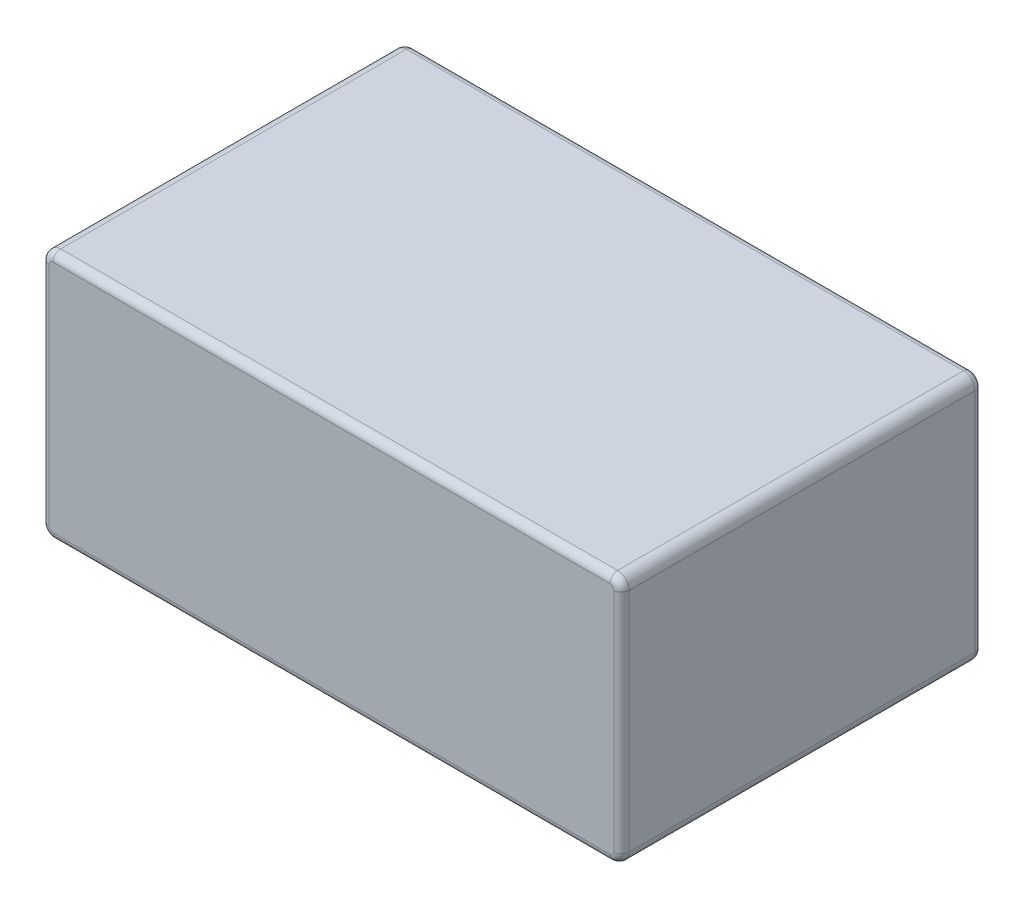
ISO-10303-21;
HEADER;
FILE_DESCRIPTION(('STEP AP214'),'2;1');
FILE_NAME('part.step','',(''),(''),'','','');
FILE_SCHEMA(('AUTOMOTIVE_DESIGN { 1 0 10303 214 1 1 1 1 }'));
ENDSEC;
DATA;
#1=APPLICATION_CONTEXT('core data for automotive mechanical design processes');
#2=APPLICATION_PROTOCOL_DEFINITION('international standard','automotive_design',2000,#1);
#3=PRODUCT_CONTEXT('',#1,'mechanical');
#4=PRODUCT('Part','Part','',(#3));
#5=PRODUCT_RELATED_PRODUCT_CATEGORY('part','',(#4));
#6=PRODUCT_DEFINITION_FORMATION('','',#4);
#7=PRODUCT_DEFINITION_CONTEXT('part definition',#1,'design');
#8=PRODUCT_DEFINITION('design','',#6,#7);
#9=PRODUCT_DEFINITION_SHAPE('','',#8);
#10=(LENGTH_UNIT() NAMED_UNIT(*) SI_UNIT(.MILLI.,.METRE.));
#11=(NAMED_UNIT(*) PLANE_ANGLE_UNIT() SI_UNIT($,.RADIAN.));
#12=(NAMED_UNIT(*) SI_UNIT($,.STERADIAN.) SOLID_ANGLE_UNIT());
#13=UNCERTAINTY_MEASURE_WITH_UNIT(LENGTH_MEASURE(1.E-05),#10,'distance_accuracy_value','');
#14=(GEOMETRIC_REPRESENTATION_CONTEXT(3) GLOBAL_UNCERTAINTY_ASSIGNED_CONTEXT((#13)) GLOBAL_UNIT_ASSIGNED_CONTEXT((#10,
#11,#12)) REPRESENTATION_CONTEXT('',''));
#15=CARTESIAN_POINT('',(0.,0.,0.));
#16=DIRECTION('',(0.,0.,1.));
#17=DIRECTION('',(1.,0.,0.));
#18=AXIS2_PLACEMENT_3D('',#15,#16,#17);
#19=CARTESIAN_POINT('',(370.,-109.5,417.));
#20=DIRECTION('',(0.,0.,-1.));
#21=DIRECTION('',(-1.,0.,0.));
#22=AXIS2_PLACEMENT_3D('',#19,#20,#21);
#23=CYLINDRICAL_SURFACE('',#22,2.99999999999995);
#24=DIRECTION('',(0.,0.,-1.));
#25=VECTOR('',#24,1.);
#26=CARTESIAN_POINT('',(370.,-112.5,417.));
#27=LINE('',#26,#25);
#28=CARTESIAN_POINT('',(370.,-112.5,415.));
#29=VERTEX_POINT('',#28);
#30=CARTESIAN_POINT('',(370.,-112.5,325.));
#31=VERTEX_POINT('',#30);
#32=EDGE_CURVE('E180',#29,#31,#27,.T.);
#33=ORIENTED_EDGE('',*,*,#32,.F.);
#34=CARTESIAN_POINT('',(370.,-109.5,415.));
#35=DIRECTION('',(0.,0.,1.));
#36=DIRECTION('',(1.,0.,0.));
#37=AXIS2_PLACEMENT_3D('',#34,#35,#36);
#38=CIRCLE('',#37,2.99999999999995);
#39=CARTESIAN_POINT('',(367.,-109.5,415.));
#40=VERTEX_POINT('',#39);
#41=EDGE_CURVE('E163',#29,#40,#38,.F.);
#42=ORIENTED_EDGE('',*,*,#41,.T.);
#43=DIRECTION('',(0.,0.,-1.));
#44=VECTOR('',#43,1.);
#45=CARTESIAN_POINT('',(367.,-109.5,417.));
#46=LINE('',#45,#44);
#47=CARTESIAN_POINT('',(367.,-109.5,325.));
#48=VERTEX_POINT('',#47);
#49=EDGE_CURVE('E258',#40,#48,#46,.T.);
#50=ORIENTED_EDGE('',*,*,#49,.T.);
#51=CARTESIAN_POINT('',(370.,-109.5,325.));
#52=DIRECTION('',(0.,0.,1.));
#53=DIRECTION('',(1.,0.,0.));
#54=AXIS2_PLACEMENT_3D('',#51,#52,#53);
#55=CIRCLE('',#54,2.99999999999995);
#56=EDGE_CURVE('E193',#48,#31,#55,.T.);
#57=ORIENTED_EDGE('',*,*,#56,.T.);
#58=EDGE_LOOP('',(#33,#42,#50,#57));
#59=FACE_BOUND('',#58,.T.);
#60=ADVANCED_FACE('F41',(#59),#23,.T.);
#61=CARTESIAN_POINT('',(370.,-112.5,417.));
#62=DIRECTION('',(0.,1.,0.));
#63=DIRECTION('',(0.,0.,1.));
#64=AXIS2_PLACEMENT_3D('',#61,#62,#63);
#65=PLANE('',#64);
#66=ORIENTED_EDGE('',*,*,#32,.T.);
#67=DIRECTION('',(1.,0.,0.));
#68=VECTOR('',#67,1.);
#69=CARTESIAN_POINT('',(370.,-112.5,325.));
#70=LINE('',#69,#68);
#71=CARTESIAN_POINT('',(515.,-112.5,325.));
#72=VERTEX_POINT('',#71);
#73=EDGE_CURVE('E230',#31,#72,#70,.T.);
#74=ORIENTED_EDGE('',*,*,#73,.T.);
#75=DIRECTION('',(0.,0.,-1.));
#76=VECTOR('',#75,1.);
#77=CARTESIAN_POINT('',(515.,-112.5,417.));
#78=LINE('',#77,#76);
#79=CARTESIAN_POINT('',(515.,-112.5,415.));
#80=VERTEX_POINT('',#79);
#81=EDGE_CURVE('E315',#80,#72,#78,.T.);
#82=ORIENTED_EDGE('',*,*,#81,.F.);
#83=DIRECTION('',(1.,0.,0.));
#84=VECTOR('',#83,1.);
#85=CARTESIAN_POINT('',(370.,-112.5,415.));
#86=LINE('',#85,#84);
#87=EDGE_CURVE('E229',#80,#29,#86,.F.);
#88=ORIENTED_EDGE('',*,*,#87,.T.);
#89=EDGE_LOOP('',(#66,#74,#82,#88));
#90=FACE_BOUND('',#89,.T.);
#91=ADVANCED_FACE('F323',(#90),#65,.F.);
#92=CARTESIAN_POINT('',(515.,-109.5,417.));
#93=DIRECTION('',(0.,0.,-1.));
#94=DIRECTION('',(-1.,0.,0.));
#95=AXIS2_PLACEMENT_3D('',#92,#93,#94);
#96=CYLINDRICAL_SURFACE('',#95,3.00000000000002);
#97=DIRECTION('',(0.,0.,-1.));
#98=VECTOR('',#97,1.);
#99=CARTESIAN_POINT('',(518.,-109.5,417.));
#100=LINE('',#99,#98);
#101=CARTESIAN_POINT('',(518.,-109.5,415.));
#102=VERTEX_POINT('',#101);
#103=CARTESIAN_POINT('',(518.,-109.5,325.));
#104=VERTEX_POINT('',#103);
#105=EDGE_CURVE('E301',#102,#104,#100,.T.);
#106=ORIENTED_EDGE('',*,*,#105,.F.);
#107=CARTESIAN_POINT('',(515.,-109.5,415.));
#108=DIRECTION('',(0.,0.,1.));
#109=DIRECTION('',(1.,0.,0.));
#110=AXIS2_PLACEMENT_3D('',#107,#108,#109);
#111=CIRCLE('',#110,3.00000000000002);
#112=EDGE_CURVE('E207',#102,#80,#111,.F.);
#113=ORIENTED_EDGE('',*,*,#112,.T.);
#114=ORIENTED_EDGE('',*,*,#81,.T.);
#115=CARTESIAN_POINT('',(515.,-109.5,325.));
#116=DIRECTION('',(0.,0.,1.));
#117=DIRECTION('',(1.,0.,0.));
#118=AXIS2_PLACEMENT_3D('',#115,#116,#117);
#119=CIRCLE('',#118,3.00000000000002);
#120=EDGE_CURVE('E210',#72,#104,#119,.T.);
#121=ORIENTED_EDGE('',*,*,#120,.T.);
#122=EDGE_LOOP('',(#106,#113,#114,#121));
#123=FACE_BOUND('',#122,.T.);
#124=ADVANCED_FACE('F365',(#123),#96,.T.);
#125=CARTESIAN_POINT('',(518.,-109.5,417.));
#126=DIRECTION('',(-1.,0.,0.));
#127=DIRECTION('',(0.,0.,1.));
#128=AXIS2_PLACEMENT_3D('',#125,#126,#127);
#129=PLANE('',#128);
#130=DIRECTION('',(0.,0.,-1.));
#131=VECTOR('',#130,1.);
#132=CARTESIAN_POINT('',(518.,-50.5,417.));
#133=LINE('',#132,#131);
#134=CARTESIAN_POINT('',(518.,-50.5,415.));
#135=VERTEX_POINT('',#134);
#136=CARTESIAN_POINT('',(518.,-50.5,325.));
#137=VERTEX_POINT('',#136);
#138=EDGE_CURVE('E302',#135,#137,#133,.T.);
#139=ORIENTED_EDGE('',*,*,#138,.F.);
#140=DIRECTION('',(0.,1.,0.));
#141=VECTOR('',#140,1.);
#142=CARTESIAN_POINT('',(518.,-109.5,415.));
#143=LINE('',#142,#141);
#144=EDGE_CURVE('E237',#135,#102,#143,.F.);
#145=ORIENTED_EDGE('',*,*,#144,.T.);
#146=ORIENTED_EDGE('',*,*,#105,.T.);
#147=DIRECTION('',(0.,1.,0.));
#148=VECTOR('',#147,1.);
#149=CARTESIAN_POINT('',(518.,-109.5,325.));
#150=LINE('',#149,#148);
#151=EDGE_CURVE('E231',#104,#137,#150,.T.);
#152=ORIENTED_EDGE('',*,*,#151,.T.);
#153=EDGE_LOOP('',(#139,#145,#146,#152));
#154=FACE_BOUND('',#153,.T.);
#155=ADVANCED_FACE('F297',(#154),#129,.F.);
#156=CARTESIAN_POINT('',(515.,-50.5,417.));
#157=DIRECTION('',(0.,0.,-1.));
#158=DIRECTION('',(-1.,0.,0.));
#159=AXIS2_PLACEMENT_3D('',#156,#157,#158);
#160=CYLINDRICAL_SURFACE('',#159,3.00000000000002);
#161=DIRECTION('',(0.,0.,-1.));
#162=VECTOR('',#161,1.);
#163=CARTESIAN_POINT('',(515.,-47.5,417.));
#164=LINE('',#163,#162);
#165=CARTESIAN_POINT('',(515.,-47.5,415.));
#166=VERTEX_POINT('',#165);
#167=CARTESIAN_POINT('',(515.,-47.5,325.));
#168=VERTEX_POINT('',#167);
#169=EDGE_CURVE('E309',#166,#168,#164,.T.);
#170=ORIENTED_EDGE('',*,*,#169,.F.);
#171=CARTESIAN_POINT('',(515.,-50.5,415.));
#172=DIRECTION('',(0.,0.,1.));
#173=DIRECTION('',(1.,0.,0.));
#174=AXIS2_PLACEMENT_3D('',#171,#172,#173);
#175=CIRCLE('',#174,3.00000000000002);
#176=EDGE_CURVE('E202',#166,#135,#175,.F.);
#177=ORIENTED_EDGE('',*,*,#176,.T.);
#178=ORIENTED_EDGE('',*,*,#138,.T.);
#179=CARTESIAN_POINT('',(515.,-50.5,325.));
#180=DIRECTION('',(0.,0.,1.));
#181=DIRECTION('',(1.,0.,0.));
#182=AXIS2_PLACEMENT_3D('',#179,#180,#181);
#183=CIRCLE('',#182,3.00000000000002);
#184=EDGE_CURVE('E205',#137,#168,#183,.T.);
#185=ORIENTED_EDGE('',*,*,#184,.T.);
#186=EDGE_LOOP('',(#170,#177,#178,#185));
#187=FACE_BOUND('',#186,.T.);
#188=ADVANCED_FACE('F307',(#187),#160,.T.);
#189=CARTESIAN_POINT('',(515.,-47.5,417.));
#190=DIRECTION('',(0.,-1.,0.));
#191=DIRECTION('',(0.,0.,-1.));
#192=AXIS2_PLACEMENT_3D('',#189,#190,#191);
#193=PLANE('',#192);
#194=DIRECTION('',(0.,0.,-1.));
#195=VECTOR('',#194,1.);
#196=CARTESIAN_POINT('',(370.,-47.5,417.));
#197=LINE('',#196,#195);
#198=CARTESIAN_POINT('',(370.,-47.5,415.));
#199=VERTEX_POINT('',#198);
#200=CARTESIAN_POINT('',(370.,-47.5,325.));
#201=VERTEX_POINT('',#200);
#202=EDGE_CURVE('E314',#199,#201,#197,.T.);
#203=ORIENTED_EDGE('',*,*,#202,.F.);
#204=DIRECTION('',(-1.,0.,0.));
#205=VECTOR('',#204,1.);
#206=CARTESIAN_POINT('',(515.,-47.5,415.));
#207=LINE('',#206,#205);
#208=EDGE_CURVE('E11',#199,#166,#207,.F.);
#209=ORIENTED_EDGE('',*,*,#208,.T.);
#210=ORIENTED_EDGE('',*,*,#169,.T.);
#211=DIRECTION('',(-1.,0.,0.));
#212=VECTOR('',#211,1.);
#213=CARTESIAN_POINT('',(515.,-47.5,325.));
#214=LINE('',#213,#212);
#215=EDGE_CURVE('E49',#168,#201,#214,.T.);
#216=ORIENTED_EDGE('',*,*,#215,.T.);
#217=EDGE_LOOP('',(#203,#209,#210,#216));
#218=FACE_BOUND('',#217,.T.);
#219=ADVANCED_FACE('F526',(#218),#193,.F.);
#220=CARTESIAN_POINT('',(370.,-50.4999999999999,417.));
#221=DIRECTION('',(0.,0.,-1.));
#222=DIRECTION('',(-1.,0.,0.));
#223=AXIS2_PLACEMENT_3D('',#220,#221,#222);
#224=CYLINDRICAL_SURFACE('',#223,2.99999999999994);
#225=DIRECTION('',(0.,0.,-1.));
#226=VECTOR('',#225,1.);
#227=CARTESIAN_POINT('',(367.,-50.5,417.));
#228=LINE('',#227,#226);
#229=CARTESIAN_POINT('',(367.,-50.5,415.));
#230=VERTEX_POINT('',#229);
#231=CARTESIAN_POINT('',(367.,-50.5,325.));
#232=VERTEX_POINT('',#231);
#233=EDGE_CURVE('E328',#230,#232,#228,.T.);
#234=ORIENTED_EDGE('',*,*,#233,.F.);
#235=CARTESIAN_POINT('',(370.,-50.4999999999999,415.));
#236=DIRECTION('',(0.,0.,1.));
#237=DIRECTION('',(1.,0.,0.));
#238=AXIS2_PLACEMENT_3D('',#235,#236,#237);
#239=CIRCLE('',#238,2.99999999999994);
#240=EDGE_CURVE('E199',#230,#199,#239,.F.);
#241=ORIENTED_EDGE('',*,*,#240,.T.);
#242=ORIENTED_EDGE('',*,*,#202,.T.);
#243=CARTESIAN_POINT('',(370.,-50.4999999999999,325.));
#244=DIRECTION('',(0.,0.,1.));
#245=DIRECTION('',(1.,0.,0.));
#246=AXIS2_PLACEMENT_3D('',#243,#244,#245);
#247=CIRCLE('',#246,2.99999999999994);
#248=EDGE_CURVE('E196',#201,#232,#247,.T.);
#249=ORIENTED_EDGE('',*,*,#248,.T.);
#250=EDGE_LOOP('',(#234,#241,#242,#249));
#251=FACE_BOUND('',#250,.T.);
#252=ADVANCED_FACE('F340',(#251),#224,.T.);
#253=CARTESIAN_POINT('',(367.,-50.5,417.));
#254=DIRECTION('',(1.,0.,0.));
#255=DIRECTION('',(0.,0.,-1.));
#256=AXIS2_PLACEMENT_3D('',#253,#254,#255);
#257=PLANE('',#256);
#258=ORIENTED_EDGE('',*,*,#233,.T.);
#259=DIRECTION('',(0.,-1.,0.));
#260=VECTOR('',#259,1.);
#261=CARTESIAN_POINT('',(367.,-50.5,325.));
#262=LINE('',#261,#260);
#263=EDGE_CURVE('E235',#232,#48,#262,.T.);
#264=ORIENTED_EDGE('',*,*,#263,.T.);
#265=ORIENTED_EDGE('',*,*,#49,.F.);
#266=DIRECTION('',(0.,-1.,0.));
#267=VECTOR('',#266,1.);
#268=CARTESIAN_POINT('',(367.,-50.5,415.));
#269=LINE('',#268,#267);
#270=EDGE_CURVE('E227',#40,#230,#269,.F.);
#271=ORIENTED_EDGE('',*,*,#270,.T.);
#272=EDGE_LOOP('',(#258,#264,#265,#271));
#273=FACE_BOUND('',#272,.T.);
#274=ADVANCED_FACE('F407',(#273),#257,.F.);
#275=CARTESIAN_POINT('',(370.,-109.5,417.));
#276=DIRECTION('',(0.,0.,1.));
#277=DIRECTION('',(1.,0.,0.));
#278=AXIS2_PLACEMENT_3D('',#275,#276,#277);
#279=PLANE('',#278);
#280=CARTESIAN_POINT('',(515.,-50.5,417.));
#281=DIRECTION('',(0.,0.,1.));
#282=DIRECTION('',(1.,0.,0.));
#283=AXIS2_PLACEMENT_3D('',#280,#281,#282);
#284=CIRCLE('',#283,1.00000000000002);
#285=CARTESIAN_POINT('',(516.,-50.5,417.));
#286=VERTEX_POINT('',#285);
#287=CARTESIAN_POINT('',(515.,-49.5,417.));
#288=VERTEX_POINT('',#287);
#289=EDGE_CURVE('E188',#286,#288,#284,.T.);
#290=ORIENTED_EDGE('',*,*,#289,.T.);
#291=DIRECTION('',(-1.,0.,0.));
#292=VECTOR('',#291,1.);
#293=CARTESIAN_POINT('',(370.,-49.5,417.));
#294=LINE('',#293,#292);
#295=CARTESIAN_POINT('',(370.,-49.5,417.));
#296=VERTEX_POINT('',#295);
#297=EDGE_CURVE('E194',#288,#296,#294,.T.);
#298=ORIENTED_EDGE('',*,*,#297,.T.);
#299=CARTESIAN_POINT('',(370.,-50.4999999999999,417.));
#300=DIRECTION('',(0.,0.,1.));
#301=DIRECTION('',(1.,0.,0.));
#302=AXIS2_PLACEMENT_3D('',#299,#300,#301);
#303=CIRCLE('',#302,0.99999999999994);
#304=CARTESIAN_POINT('',(369.,-50.5,417.));
#305=VERTEX_POINT('',#304);
#306=EDGE_CURVE('E192',#296,#305,#303,.T.);
#307=ORIENTED_EDGE('',*,*,#306,.T.);
#308=DIRECTION('',(0.,-1.,0.));
#309=VECTOR('',#308,1.);
#310=CARTESIAN_POINT('',(369.,-109.5,417.));
#311=LINE('',#310,#309);
#312=CARTESIAN_POINT('',(369.,-109.5,417.));
#313=VERTEX_POINT('',#312);
#314=EDGE_CURVE('E182',#305,#313,#311,.T.);
#315=ORIENTED_EDGE('',*,*,#314,.T.);
#316=CARTESIAN_POINT('',(370.,-109.5,417.));
#317=DIRECTION('',(0.,0.,1.));
#318=DIRECTION('',(1.,0.,0.));
#319=AXIS2_PLACEMENT_3D('',#316,#317,#318);
#320=CIRCLE('',#319,0.999999999999947);
#321=CARTESIAN_POINT('',(370.,-110.5,417.));
#322=VERTEX_POINT('',#321);
#323=EDGE_CURVE('E165',#313,#322,#320,.T.);
#324=ORIENTED_EDGE('',*,*,#323,.T.);
#325=DIRECTION('',(1.,0.,0.));
#326=VECTOR('',#325,1.);
#327=CARTESIAN_POINT('',(515.,-110.5,417.));
#328=LINE('',#327,#326);
#329=CARTESIAN_POINT('',(515.,-110.5,417.));
#330=VERTEX_POINT('',#329);
#331=EDGE_CURVE('E168',#322,#330,#328,.T.);
#332=ORIENTED_EDGE('',*,*,#331,.T.);
#333=CARTESIAN_POINT('',(515.,-109.5,417.));
#334=DIRECTION('',(0.,0.,1.));
#335=DIRECTION('',(1.,0.,0.));
#336=AXIS2_PLACEMENT_3D('',#333,#334,#335);
#337=CIRCLE('',#336,1.00000000000002);
#338=CARTESIAN_POINT('',(516.,-109.5,417.));
#339=VERTEX_POINT('',#338);
#340=EDGE_CURVE('E177',#330,#339,#337,.T.);
#341=ORIENTED_EDGE('',*,*,#340,.T.);
#342=DIRECTION('',(0.,1.,0.));
#343=VECTOR('',#342,1.);
#344=CARTESIAN_POINT('',(516.,-50.5,417.));
#345=LINE('',#344,#343);
#346=EDGE_CURVE('E184',#339,#286,#345,.T.);
#347=ORIENTED_EDGE('',*,*,#346,.T.);
#348=EDGE_LOOP('',(#290,#298,#307,#315,#324,#332,#341,#347));
#349=FACE_BOUND('',#348,.T.);
#350=ADVANCED_FACE('F176',(#349),#279,.T.);
#351=CARTESIAN_POINT('',(370.,-109.5,323.));
#352=DIRECTION('',(0.,0.,1.));
#353=DIRECTION('',(1.,0.,0.));
#354=AXIS2_PLACEMENT_3D('',#351,#352,#353);
#355=PLANE('',#354);
#356=CARTESIAN_POINT('',(515.,-50.5,323.));
#357=DIRECTION('',(0.,0.,1.));
#358=DIRECTION('',(1.,0.,0.));
#359=AXIS2_PLACEMENT_3D('',#356,#357,#358);
#360=CIRCLE('',#359,1.00000000000002);
#361=CARTESIAN_POINT('',(515.,-49.5,323.));
#362=VERTEX_POINT('',#361);
#363=CARTESIAN_POINT('',(516.,-50.5,323.));
#364=VERTEX_POINT('',#363);
#365=EDGE_CURVE('E224',#362,#364,#360,.F.);
#366=ORIENTED_EDGE('',*,*,#365,.T.);
#367=DIRECTION('',(0.,1.,0.));
#368=VECTOR('',#367,1.);
#369=CARTESIAN_POINT('',(516.,-109.5,323.));
#370=LINE('',#369,#368);
#371=CARTESIAN_POINT('',(516.,-109.5,323.));
#372=VERTEX_POINT('',#371);
#373=EDGE_CURVE('E62',#364,#372,#370,.F.);
#374=ORIENTED_EDGE('',*,*,#373,.T.);
#375=CARTESIAN_POINT('',(515.,-109.5,323.));
#376=DIRECTION('',(0.,0.,1.));
#377=DIRECTION('',(1.,0.,0.));
#378=AXIS2_PLACEMENT_3D('',#375,#376,#377);
#379=CIRCLE('',#378,1.00000000000002);
#380=CARTESIAN_POINT('',(515.,-110.5,323.));
#381=VERTEX_POINT('',#380);
#382=EDGE_CURVE('E222',#372,#381,#379,.F.);
#383=ORIENTED_EDGE('',*,*,#382,.T.);
#384=DIRECTION('',(1.,0.,0.));
#385=VECTOR('',#384,1.);
#386=CARTESIAN_POINT('',(370.,-110.5,323.));
#387=LINE('',#386,#385);
#388=CARTESIAN_POINT('',(370.,-110.5,323.));
#389=VERTEX_POINT('',#388);
#390=EDGE_CURVE('E218',#381,#389,#387,.F.);
#391=ORIENTED_EDGE('',*,*,#390,.T.);
#392=CARTESIAN_POINT('',(370.,-109.5,323.));
#393=DIRECTION('',(0.,0.,1.));
#394=DIRECTION('',(1.,0.,0.));
#395=AXIS2_PLACEMENT_3D('',#392,#393,#394);
#396=CIRCLE('',#395,0.999999999999947);
#397=CARTESIAN_POINT('',(369.,-109.5,323.));
#398=VERTEX_POINT('',#397);
#399=EDGE_CURVE('E220',#389,#398,#396,.F.);
#400=ORIENTED_EDGE('',*,*,#399,.T.);
#401=DIRECTION('',(0.,-1.,0.));
#402=VECTOR('',#401,1.);
#403=CARTESIAN_POINT('',(369.,-109.5,323.));
#404=LINE('',#403,#402);
#405=CARTESIAN_POINT('',(369.,-50.5,323.));
#406=VERTEX_POINT('',#405);
#407=EDGE_CURVE('E214',#398,#406,#404,.F.);
#408=ORIENTED_EDGE('',*,*,#407,.T.);
#409=CARTESIAN_POINT('',(370.,-50.4999999999999,323.));
#410=DIRECTION('',(0.,0.,1.));
#411=DIRECTION('',(1.,0.,0.));
#412=AXIS2_PLACEMENT_3D('',#409,#410,#411);
#413=CIRCLE('',#412,0.99999999999994);
#414=CARTESIAN_POINT('',(370.,-49.5,323.));
#415=VERTEX_POINT('',#414);
#416=EDGE_CURVE('E213',#406,#415,#413,.F.);
#417=ORIENTED_EDGE('',*,*,#416,.T.);
#418=DIRECTION('',(-1.,0.,0.));
#419=VECTOR('',#418,1.);
#420=CARTESIAN_POINT('',(370.,-49.5,323.));
#421=LINE('',#420,#419);
#422=EDGE_CURVE('E211',#415,#362,#421,.F.);
#423=ORIENTED_EDGE('',*,*,#422,.T.);
#424=EDGE_LOOP('',(#366,#374,#383,#391,#400,#408,#417,#423));
#425=FACE_BOUND('',#424,.T.);
#426=ADVANCED_FACE('F290',(#425),#355,.F.);
#427=CARTESIAN_POINT('',(515.,-50.5,415.));
#428=DIRECTION('',(0.,0.,1.));
#429=DIRECTION('',(1.,0.,0.));
#430=AXIS2_PLACEMENT_3D('',#427,#428,#429);
#431=DEGENERATE_TOROIDAL_SURFACE('',#430,1.00000000000002,2.,.T.);
#432=CARTESIAN_POINT('',(516.,-50.5,415.));
#433=DIRECTION('',(0.,-1.,0.));
#434=DIRECTION('',(1.,0.,0.));
#435=AXIS2_PLACEMENT_3D('',#432,#433,#434);
#436=CIRCLE('',#435,2.);
#437=EDGE_CURVE('E248',#135,#286,#436,.T.);
#438=ORIENTED_EDGE('',*,*,#437,.F.);
#439=ORIENTED_EDGE('',*,*,#176,.F.);
#440=CARTESIAN_POINT('',(515.,-49.5,415.));
#441=DIRECTION('',(-1.,0.,0.));
#442=DIRECTION('',(0.,0.,1.));
#443=AXIS2_PLACEMENT_3D('',#440,#441,#442);
#444=CIRCLE('',#443,2.);
#445=EDGE_CURVE('E251',#288,#166,#444,.T.);
#446=ORIENTED_EDGE('',*,*,#445,.F.);
#447=ORIENTED_EDGE('',*,*,#289,.F.);
#448=EDGE_LOOP('',(#438,#439,#446,#447));
#449=FACE_BOUND('',#448,.T.);
#450=ADVANCED_FACE('F388',(#449),#431,.T.);
#451=CARTESIAN_POINT('',(370.,-49.5,415.));
#452=DIRECTION('',(1.,0.,0.));
#453=DIRECTION('',(0.,0.,-1.));
#454=AXIS2_PLACEMENT_3D('',#451,#452,#453);
#455=CYLINDRICAL_SURFACE('',#454,2.);
#456=ORIENTED_EDGE('',*,*,#445,.T.);
#457=ORIENTED_EDGE('',*,*,#208,.F.);
#458=CARTESIAN_POINT('',(370.,-49.5,415.));
#459=DIRECTION('',(-1.,0.,0.));
#460=DIRECTION('',(0.,-1.,0.));
#461=AXIS2_PLACEMENT_3D('',#458,#459,#460);
#462=CIRCLE('',#461,2.);
#463=EDGE_CURVE('E250',#296,#199,#462,.T.);
#464=ORIENTED_EDGE('',*,*,#463,.F.);
#465=ORIENTED_EDGE('',*,*,#297,.F.);
#466=EDGE_LOOP('',(#456,#457,#464,#465));
#467=FACE_BOUND('',#466,.T.);
#468=ADVANCED_FACE('F390',(#467),#455,.T.);
#469=CARTESIAN_POINT('',(516.,-109.5,415.));
#470=DIRECTION('',(0.,-1.,0.));
#471=DIRECTION('',(0.,0.,-1.));
#472=AXIS2_PLACEMENT_3D('',#469,#470,#471);
#473=CYLINDRICAL_SURFACE('',#472,2.);
#474=ORIENTED_EDGE('',*,*,#437,.T.);
#475=ORIENTED_EDGE('',*,*,#346,.F.);
#476=CARTESIAN_POINT('',(516.,-109.5,415.));
#477=DIRECTION('',(0.,-1.,0.));
#478=DIRECTION('',(0.,0.,-1.));
#479=AXIS2_PLACEMENT_3D('',#476,#477,#478);
#480=CIRCLE('',#479,2.);
#481=EDGE_CURVE('E243',#102,#339,#480,.T.);
#482=ORIENTED_EDGE('',*,*,#481,.F.);
#483=ORIENTED_EDGE('',*,*,#144,.F.);
#484=EDGE_LOOP('',(#474,#475,#482,#483));
#485=FACE_BOUND('',#484,.T.);
#486=ADVANCED_FACE('F382',(#485),#473,.T.);
#487=CARTESIAN_POINT('',(370.,-50.4999999999999,415.));
#488=DIRECTION('',(0.,0.,1.));
#489=DIRECTION('',(1.,0.,0.));
#490=AXIS2_PLACEMENT_3D('',#487,#488,#489);
#491=DEGENERATE_TOROIDAL_SURFACE('',#490,0.99999999999994,2.,.T.);
#492=ORIENTED_EDGE('',*,*,#463,.T.);
#493=ORIENTED_EDGE('',*,*,#240,.F.);
#494=CARTESIAN_POINT('',(369.,-50.5,415.));
#495=DIRECTION('',(0.,-1.,0.));
#496=DIRECTION('',(1.,0.,0.));
#497=AXIS2_PLACEMENT_3D('',#494,#495,#496);
#498=CIRCLE('',#497,2.);
#499=EDGE_CURVE('E244',#305,#230,#498,.T.);
#500=ORIENTED_EDGE('',*,*,#499,.F.);
#501=ORIENTED_EDGE('',*,*,#306,.F.);
#502=EDGE_LOOP('',(#492,#493,#500,#501));
#503=FACE_BOUND('',#502,.T.);
#504=ADVANCED_FACE('F377',(#503),#491,.T.);
#505=CARTESIAN_POINT('',(515.,-109.5,415.));
#506=DIRECTION('',(0.,0.,1.));
#507=DIRECTION('',(1.,0.,0.));
#508=AXIS2_PLACEMENT_3D('',#505,#506,#507);
#509=DEGENERATE_TOROIDAL_SURFACE('',#508,1.00000000000002,2.,.T.);
#510=ORIENTED_EDGE('',*,*,#481,.T.);
#511=ORIENTED_EDGE('',*,*,#340,.F.);
#512=CARTESIAN_POINT('',(515.,-110.5,415.));
#513=DIRECTION('',(-1.,0.,0.));
#514=DIRECTION('',(0.,0.,1.));
#515=AXIS2_PLACEMENT_3D('',#512,#513,#514);
#516=CIRCLE('',#515,2.);
#517=EDGE_CURVE('E175',#80,#330,#516,.T.);
#518=ORIENTED_EDGE('',*,*,#517,.F.);
#519=ORIENTED_EDGE('',*,*,#112,.F.);
#520=EDGE_LOOP('',(#510,#511,#518,#519));
#521=FACE_BOUND('',#520,.T.);
#522=ADVANCED_FACE('F374',(#521),#509,.T.);
#523=CARTESIAN_POINT('',(369.,-109.5,415.));
#524=DIRECTION('',(0.,1.,0.));
#525=DIRECTION('',(0.,0.,1.));
#526=AXIS2_PLACEMENT_3D('',#523,#524,#525);
#527=CYLINDRICAL_SURFACE('',#526,2.);
#528=ORIENTED_EDGE('',*,*,#499,.T.);
#529=ORIENTED_EDGE('',*,*,#270,.F.);
#530=CARTESIAN_POINT('',(369.,-109.5,415.));
#531=DIRECTION('',(0.,-1.,0.));
#532=DIRECTION('',(1.,0.,0.));
#533=AXIS2_PLACEMENT_3D('',#530,#531,#532);
#534=CIRCLE('',#533,2.);
#535=EDGE_CURVE('E170',#313,#40,#534,.T.);
#536=ORIENTED_EDGE('',*,*,#535,.F.);
#537=ORIENTED_EDGE('',*,*,#314,.F.);
#538=EDGE_LOOP('',(#528,#529,#536,#537));
#539=FACE_BOUND('',#538,.T.);
#540=ADVANCED_FACE('F375',(#539),#527,.T.);
#541=CARTESIAN_POINT('',(370.,-110.5,415.));
#542=DIRECTION('',(-1.,0.,0.));
#543=DIRECTION('',(0.,0.,1.));
#544=AXIS2_PLACEMENT_3D('',#541,#542,#543);
#545=CYLINDRICAL_SURFACE('',#544,2.);
#546=ORIENTED_EDGE('',*,*,#517,.T.);
#547=ORIENTED_EDGE('',*,*,#331,.F.);
#548=CARTESIAN_POINT('',(370.,-110.5,415.));
#549=DIRECTION('',(-1.,0.,0.));
#550=DIRECTION('',(0.,0.,1.));
#551=AXIS2_PLACEMENT_3D('',#548,#549,#550);
#552=CIRCLE('',#551,2.);
#553=EDGE_CURVE('E158',#29,#322,#552,.T.);
#554=ORIENTED_EDGE('',*,*,#553,.F.);
#555=ORIENTED_EDGE('',*,*,#87,.F.);
#556=EDGE_LOOP('',(#546,#547,#554,#555));
#557=FACE_BOUND('',#556,.T.);
#558=ADVANCED_FACE('F174',(#557),#545,.T.);
#559=CARTESIAN_POINT('',(370.,-109.5,415.));
#560=DIRECTION('',(0.,0.,1.));
#561=DIRECTION('',(1.,0.,0.));
#562=AXIS2_PLACEMENT_3D('',#559,#560,#561);
#563=DEGENERATE_TOROIDAL_SURFACE('',#562,0.999999999999947,2.,.T.);
#564=ORIENTED_EDGE('',*,*,#535,.T.);
#565=ORIENTED_EDGE('',*,*,#41,.F.);
#566=ORIENTED_EDGE('',*,*,#553,.T.);
#567=ORIENTED_EDGE('',*,*,#323,.F.);
#568=EDGE_LOOP('',(#564,#565,#566,#567));
#569=FACE_BOUND('',#568,.T.);
#570=ADVANCED_FACE('F159',(#569),#563,.T.);
#571=CARTESIAN_POINT('',(370.,-109.5,325.));
#572=DIRECTION('',(0.,0.,1.));
#573=DIRECTION('',(1.,0.,0.));
#574=AXIS2_PLACEMENT_3D('',#571,#572,#573);
#575=DEGENERATE_TOROIDAL_SURFACE('',#574,0.999999999999947,2.,.T.);
#576=CARTESIAN_POINT('',(369.,-109.5,325.));
#577=DIRECTION('',(0.,1.,0.));
#578=DIRECTION('',(-1.,0.,0.));
#579=AXIS2_PLACEMENT_3D('',#576,#577,#578);
#580=CIRCLE('',#579,2.);
#581=EDGE_CURVE('E271',#398,#48,#580,.T.);
#582=ORIENTED_EDGE('',*,*,#581,.F.);
#583=ORIENTED_EDGE('',*,*,#399,.F.);
#584=CARTESIAN_POINT('',(370.,-110.5,325.));
#585=DIRECTION('',(1.,0.,0.));
#586=DIRECTION('',(0.,0.,-1.));
#587=AXIS2_PLACEMENT_3D('',#584,#585,#586);
#588=CIRCLE('',#587,2.);
#589=EDGE_CURVE('E44',#31,#389,#588,.T.);
#590=ORIENTED_EDGE('',*,*,#589,.F.);
#591=ORIENTED_EDGE('',*,*,#56,.F.);
#592=EDGE_LOOP('',(#582,#583,#590,#591));
#593=FACE_BOUND('',#592,.T.);
#594=ADVANCED_FACE('F43',(#593),#575,.T.);
#595=CARTESIAN_POINT('',(370.,-110.5,325.));
#596=DIRECTION('',(1.,0.,0.));
#597=DIRECTION('',(0.,0.,-1.));
#598=AXIS2_PLACEMENT_3D('',#595,#596,#597);
#599=CYLINDRICAL_SURFACE('',#598,2.);
#600=ORIENTED_EDGE('',*,*,#589,.T.);
#601=ORIENTED_EDGE('',*,*,#390,.F.);
#602=CARTESIAN_POINT('',(515.,-110.5,325.));
#603=DIRECTION('',(1.,0.,0.));
#604=DIRECTION('',(0.,0.,-1.));
#605=AXIS2_PLACEMENT_3D('',#602,#603,#604);
#606=CIRCLE('',#605,2.);
#607=EDGE_CURVE('E267',#72,#381,#606,.T.);
#608=ORIENTED_EDGE('',*,*,#607,.F.);
#609=ORIENTED_EDGE('',*,*,#73,.F.);
#610=EDGE_LOOP('',(#600,#601,#608,#609));
#611=FACE_BOUND('',#610,.T.);
#612=ADVANCED_FACE('F281',(#611),#599,.T.);
#613=CARTESIAN_POINT('',(369.,-50.5,325.));
#614=DIRECTION('',(0.,-1.,0.));
#615=DIRECTION('',(0.,0.,-1.));
#616=AXIS2_PLACEMENT_3D('',#613,#614,#615);
#617=CYLINDRICAL_SURFACE('',#616,2.);
#618=ORIENTED_EDGE('',*,*,#581,.T.);
#619=ORIENTED_EDGE('',*,*,#263,.F.);
#620=CARTESIAN_POINT('',(369.,-50.5,325.));
#621=DIRECTION('',(0.,1.,0.));
#622=DIRECTION('',(0.,0.,1.));
#623=AXIS2_PLACEMENT_3D('',#620,#621,#622);
#624=CIRCLE('',#623,2.);
#625=EDGE_CURVE('E266',#406,#232,#624,.T.);
#626=ORIENTED_EDGE('',*,*,#625,.F.);
#627=ORIENTED_EDGE('',*,*,#407,.F.);
#628=EDGE_LOOP('',(#618,#619,#626,#627));
#629=FACE_BOUND('',#628,.T.);
#630=ADVANCED_FACE('F412',(#629),#617,.T.);
#631=CARTESIAN_POINT('',(515.,-109.5,325.));
#632=DIRECTION('',(0.,0.,1.));
#633=DIRECTION('',(1.,0.,0.));
#634=AXIS2_PLACEMENT_3D('',#631,#632,#633);
#635=DEGENERATE_TOROIDAL_SURFACE('',#634,1.00000000000002,2.,.T.);
#636=ORIENTED_EDGE('',*,*,#607,.T.);
#637=ORIENTED_EDGE('',*,*,#382,.F.);
#638=CARTESIAN_POINT('',(516.,-109.5,325.));
#639=DIRECTION('',(0.,1.,0.));
#640=DIRECTION('',(0.,0.,1.));
#641=AXIS2_PLACEMENT_3D('',#638,#639,#640);
#642=CIRCLE('',#641,2.);
#643=EDGE_CURVE('E263',#104,#372,#642,.T.);
#644=ORIENTED_EDGE('',*,*,#643,.F.);
#645=ORIENTED_EDGE('',*,*,#120,.F.);
#646=EDGE_LOOP('',(#636,#637,#644,#645));
#647=FACE_BOUND('',#646,.T.);
#648=ADVANCED_FACE('F292',(#647),#635,.T.);
#649=CARTESIAN_POINT('',(370.,-50.4999999999999,325.));
#650=DIRECTION('',(0.,0.,1.));
#651=DIRECTION('',(1.,0.,0.));
#652=AXIS2_PLACEMENT_3D('',#649,#650,#651);
#653=DEGENERATE_TOROIDAL_SURFACE('',#652,0.99999999999994,2.,.T.);
#654=ORIENTED_EDGE('',*,*,#625,.T.);
#655=ORIENTED_EDGE('',*,*,#248,.F.);
#656=CARTESIAN_POINT('',(370.,-49.5,325.));
#657=DIRECTION('',(1.,0.,0.));
#658=DIRECTION('',(0.,1.,0.));
#659=AXIS2_PLACEMENT_3D('',#656,#657,#658);
#660=CIRCLE('',#659,2.);
#661=EDGE_CURVE('E257',#415,#201,#660,.T.);
#662=ORIENTED_EDGE('',*,*,#661,.F.);
#663=ORIENTED_EDGE('',*,*,#416,.F.);
#664=EDGE_LOOP('',(#654,#655,#662,#663));
#665=FACE_BOUND('',#664,.T.);
#666=ADVANCED_FACE('F341',(#665),#653,.T.);
#667=CARTESIAN_POINT('',(516.,-109.5,325.));
#668=DIRECTION('',(0.,1.,0.));
#669=DIRECTION('',(0.,0.,1.));
#670=AXIS2_PLACEMENT_3D('',#667,#668,#669);
#671=CYLINDRICAL_SURFACE('',#670,2.);
#672=ORIENTED_EDGE('',*,*,#643,.T.);
#673=ORIENTED_EDGE('',*,*,#373,.F.);
#674=CARTESIAN_POINT('',(516.,-50.5,325.));
#675=DIRECTION('',(0.,1.,0.));
#676=DIRECTION('',(0.,0.,1.));
#677=AXIS2_PLACEMENT_3D('',#674,#675,#676);
#678=CIRCLE('',#677,2.);
#679=EDGE_CURVE('E59',#137,#364,#678,.T.);
#680=ORIENTED_EDGE('',*,*,#679,.F.);
#681=ORIENTED_EDGE('',*,*,#151,.F.);
#682=EDGE_LOOP('',(#672,#673,#680,#681));
#683=FACE_BOUND('',#682,.T.);
#684=ADVANCED_FACE('F293',(#683),#671,.T.);
#685=CARTESIAN_POINT('',(515.,-49.5,325.));
#686=DIRECTION('',(-1.,0.,0.));
#687=DIRECTION('',(0.,0.,1.));
#688=AXIS2_PLACEMENT_3D('',#685,#686,#687);
#689=CYLINDRICAL_SURFACE('',#688,2.);
#690=ORIENTED_EDGE('',*,*,#661,.T.);
#691=ORIENTED_EDGE('',*,*,#215,.F.);
#692=CARTESIAN_POINT('',(515.,-49.5,325.));
#693=DIRECTION('',(1.,0.,0.));
#694=DIRECTION('',(0.,0.,-1.));
#695=AXIS2_PLACEMENT_3D('',#692,#693,#694);
#696=CIRCLE('',#695,2.);
#697=EDGE_CURVE('E260',#362,#168,#696,.T.);
#698=ORIENTED_EDGE('',*,*,#697,.F.);
#699=ORIENTED_EDGE('',*,*,#422,.F.);
#700=EDGE_LOOP('',(#690,#691,#698,#699));
#701=FACE_BOUND('',#700,.T.);
#702=ADVANCED_FACE('F349',(#701),#689,.T.);
#703=CARTESIAN_POINT('',(515.,-50.5,325.));
#704=DIRECTION('',(0.,0.,1.));
#705=DIRECTION('',(1.,0.,0.));
#706=AXIS2_PLACEMENT_3D('',#703,#704,#705);
#707=DEGENERATE_TOROIDAL_SURFACE('',#706,1.00000000000002,2.,.T.);
#708=ORIENTED_EDGE('',*,*,#679,.T.);
#709=ORIENTED_EDGE('',*,*,#365,.F.);
#710=ORIENTED_EDGE('',*,*,#697,.T.);
#711=ORIENTED_EDGE('',*,*,#184,.F.);
#712=EDGE_LOOP('',(#708,#709,#710,#711));
#713=FACE_BOUND('',#712,.T.);
#714=ADVANCED_FACE('F354',(#713),#707,.T.);
#715=CLOSED_SHELL('',(#60,#91,#124,#155,#188,#219,#252,#274,#350,#426,#450,#468,#486,#504,#522,
#540,#558,#570,#594,#612,#630,#648,#666,#684,#702,#714));
#716=MANIFOLD_SOLID_BREP('B2',#715);
#717=ADVANCED_BREP_SHAPE_REPRESENTATION('',(#18,#716),#14);
#718=SHAPE_DEFINITION_REPRESENTATION(#9,#717);
ENDSEC;
END-ISO-10303-21;
